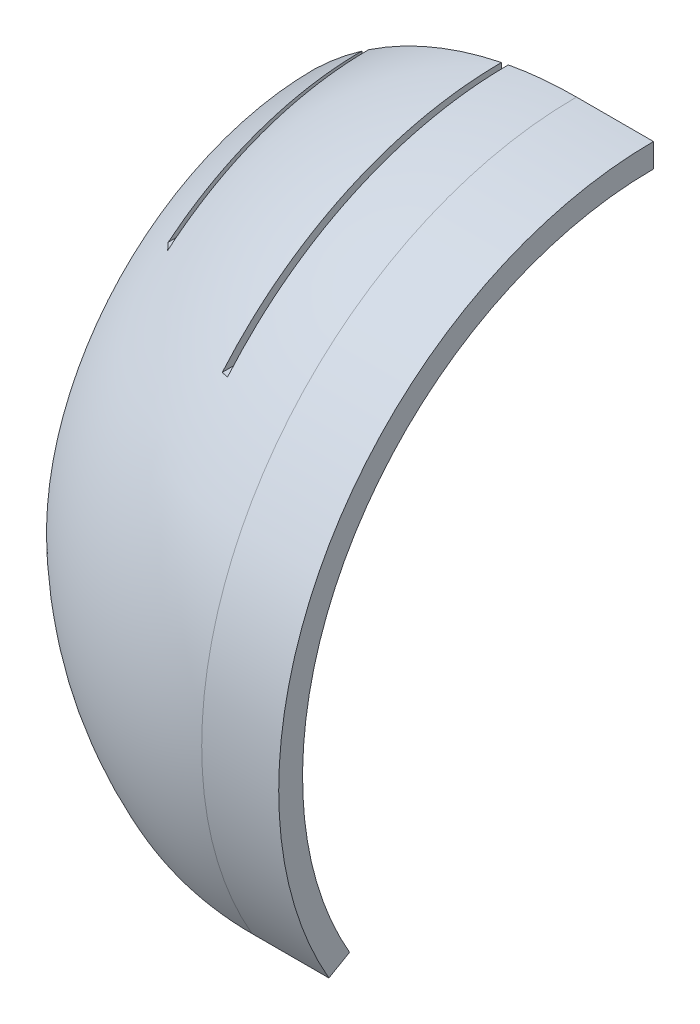
ISO-10303-21;
HEADER;
FILE_DESCRIPTION(('STEP AP214'),'2;1');
FILE_NAME('part.step','',(''),(''),'','','');
FILE_SCHEMA(('AUTOMOTIVE_DESIGN { 1 0 10303 214 1 1 1 1 }'));
ENDSEC;
DATA;
#1=APPLICATION_CONTEXT('core data for automotive mechanical design processes');
#2=APPLICATION_PROTOCOL_DEFINITION('international standard','automotive_design',2000,#1);
#3=PRODUCT_CONTEXT('',#1,'mechanical');
#4=PRODUCT('Part','Part','',(#3));
#5=PRODUCT_RELATED_PRODUCT_CATEGORY('part','',(#4));
#6=PRODUCT_DEFINITION_FORMATION('','',#4);
#7=PRODUCT_DEFINITION_CONTEXT('part definition',#1,'design');
#8=PRODUCT_DEFINITION('design','',#6,#7);
#9=PRODUCT_DEFINITION_SHAPE('','',#8);
#10=(LENGTH_UNIT() NAMED_UNIT(*) SI_UNIT(.MILLI.,.METRE.));
#11=(NAMED_UNIT(*) PLANE_ANGLE_UNIT() SI_UNIT($,.RADIAN.));
#12=(NAMED_UNIT(*) SI_UNIT($,.STERADIAN.) SOLID_ANGLE_UNIT());
#13=UNCERTAINTY_MEASURE_WITH_UNIT(LENGTH_MEASURE(1.E-05),#10,'distance_accuracy_value','');
#14=(GEOMETRIC_REPRESENTATION_CONTEXT(3) GLOBAL_UNCERTAINTY_ASSIGNED_CONTEXT((#13)) GLOBAL_UNIT_ASSIGNED_CONTEXT((#10,
#11,#12)) REPRESENTATION_CONTEXT('',''));
#15=CARTESIAN_POINT('',(0.,0.,0.));
#16=DIRECTION('',(0.,0.,1.));
#17=DIRECTION('',(1.,0.,0.));
#18=AXIS2_PLACEMENT_3D('',#15,#16,#17);
#19=CARTESIAN_POINT('',(0.,0.,0.));
#20=DIRECTION('',(0.,0.,1.));
#21=DIRECTION('',(1.,0.,0.));
#22=AXIS2_PLACEMENT_3D('',#19,#20,#21);
#23=PLANE('',#22);
#24=CARTESIAN_POINT('',(0.,0.,0.));
#25=DIRECTION('',(0.,0.,1.));
#26=DIRECTION('',(1.,0.,0.));
#27=AXIS2_PLACEMENT_3D('',#24,#25,#26);
#28=CIRCLE('',#27,55.);
#29=CARTESIAN_POINT('',(-31.5,45.0860288781347,0.));
#30=VERTEX_POINT('',#29);
#31=CARTESIAN_POINT('',(-38.5,39.2778563569857,0.));
#32=VERTEX_POINT('',#31);
#33=EDGE_CURVE('E216',#30,#32,#28,.T.);
#34=ORIENTED_EDGE('',*,*,#33,.F.);
#35=DIRECTION('',(0.,-1.,0.));
#36=VECTOR('',#35,1.);
#37=CARTESIAN_POINT('',(-31.5,0.,0.));
#38=LINE('',#37,#36);
#39=CARTESIAN_POINT('',(-31.5,40.7430975749267,0.));
#40=VERTEX_POINT('',#39);
#41=EDGE_CURVE('E253',#30,#40,#38,.T.);
#42=ORIENTED_EDGE('',*,*,#41,.T.);
#43=CARTESIAN_POINT('',(0.,0.,0.));
#44=DIRECTION('',(0.,0.,1.));
#45=DIRECTION('',(1.,0.,0.));
#46=AXIS2_PLACEMENT_3D('',#43,#44,#45);
#47=CIRCLE('',#46,51.5);
#48=CARTESIAN_POINT('',(-38.5,34.2052627529741,0.));
#49=VERTEX_POINT('',#48);
#50=EDGE_CURVE('E222',#49,#40,#47,.F.);
#51=ORIENTED_EDGE('',*,*,#50,.F.);
#52=DIRECTION('',(0.,1.,0.));
#53=VECTOR('',#52,1.);
#54=CARTESIAN_POINT('',(-38.5,0.,0.));
#55=LINE('',#54,#53);
#56=EDGE_CURVE('E237',#49,#32,#55,.T.);
#57=ORIENTED_EDGE('',*,*,#56,.T.);
#58=EDGE_LOOP('',(#34,#42,#51,#57));
#59=FACE_BOUND('',#58,.T.);
#60=ADVANCED_FACE('F50',(#59),#23,.F.);
#61=CARTESIAN_POINT('',(-10.,50.519798099359,0.));
#62=VERTEX_POINT('',#61);
#63=CARTESIAN_POINT('',(0.,51.5,0.));
#64=VERTEX_POINT('',#63);
#65=EDGE_CURVE('E220',#62,#64,#47,.F.);
#66=ORIENTED_EDGE('',*,*,#65,.F.);
#67=DIRECTION('',(0.,1.,0.));
#68=VECTOR('',#67,1.);
#69=CARTESIAN_POINT('',(-10.,0.,0.));
#70=LINE('',#69,#68);
#71=CARTESIAN_POINT('',(-10.,54.0832691319598,0.));
#72=VERTEX_POINT('',#71);
#73=EDGE_CURVE('E248',#62,#72,#70,.T.);
#74=ORIENTED_EDGE('',*,*,#73,.T.);
#75=CARTESIAN_POINT('',(0.,55.,0.));
#76=VERTEX_POINT('',#75);
#77=EDGE_CURVE('E217',#76,#72,#28,.T.);
#78=ORIENTED_EDGE('',*,*,#77,.F.);
#79=DIRECTION('',(-1.,0.,0.));
#80=VECTOR('',#79,1.);
#81=CARTESIAN_POINT('',(10.,55.,0.));
#82=LINE('',#81,#80);
#83=CARTESIAN_POINT('',(11.3,55.,-1.92031473636372E-13));
#84=VERTEX_POINT('',#83);
#85=EDGE_CURVE('E161',#84,#76,#82,.T.);
#86=ORIENTED_EDGE('',*,*,#85,.F.);
#87=DIRECTION('',(0.,1.,0.));
#88=VECTOR('',#87,1.);
#89=CARTESIAN_POINT('',(11.3,55.,-1.92031473636372E-13));
#90=LINE('',#89,#88);
#91=CARTESIAN_POINT('',(11.3,51.5,-1.79811288950421E-13));
#92=VERTEX_POINT('',#91);
#93=EDGE_CURVE('E162',#92,#84,#90,.T.);
#94=ORIENTED_EDGE('',*,*,#93,.F.);
#95=DIRECTION('',(-1.,0.,0.));
#96=VECTOR('',#95,1.);
#97=CARTESIAN_POINT('',(0.,51.5,0.));
#98=LINE('',#97,#96);
#99=EDGE_CURVE('E13',#64,#92,#98,.F.);
#100=ORIENTED_EDGE('',*,*,#99,.F.);
#101=EDGE_LOOP('',(#66,#74,#78,#86,#94,#100));
#102=FACE_BOUND('',#101,.T.);
#103=ADVANCED_FACE('F286',(#102),#23,.F.);
#104=CARTESIAN_POINT('',(0.,0.,0.));
#105=DIRECTION('',(0.,-1.,0.));
#106=DIRECTION('',(-1.,0.,0.));
#107=AXIS2_PLACEMENT_3D('',#104,#105,#106);
#108=SPHERICAL_SURFACE('',#107,51.5);
#109=ORIENTED_EDGE('',*,*,#50,.T.);
#110=CARTESIAN_POINT('',(-31.5,0.,0.));
#111=DIRECTION('',(-1.,0.,0.));
#112=DIRECTION('',(0.,0.,1.));
#113=AXIS2_PLACEMENT_3D('',#110,#111,#112);
#114=CIRCLE('',#113,40.7430975749267);
#115=CARTESIAN_POINT('',(-31.5,35.,20.8566536146142));
#116=VERTEX_POINT('',#115);
#117=EDGE_CURVE('E207',#40,#116,#114,.F.);
#118=ORIENTED_EDGE('',*,*,#117,.T.);
#119=CARTESIAN_POINT('',(0.,35.,0.));
#120=DIRECTION('',(0.,-1.,0.));
#121=DIRECTION('',(0.,0.,-1.));
#122=AXIS2_PLACEMENT_3D('',#119,#120,#121);
#123=CIRCLE('',#122,37.7789623997272);
#124=CARTESIAN_POINT('',(-30.5,35.,22.2934968096079));
#125=VERTEX_POINT('',#124);
#126=EDGE_CURVE('E213',#116,#125,#123,.F.);
#127=ORIENTED_EDGE('',*,*,#126,.T.);
#128=CARTESIAN_POINT('',(-30.5,0.,0.));
#129=DIRECTION('',(1.,0.,0.));
#130=DIRECTION('',(0.,1.,0.));
#131=AXIS2_PLACEMENT_3D('',#128,#129,#130);
#132=CIRCLE('',#131,41.4969878424928);
#133=CARTESIAN_POINT('',(-30.5,41.4969878424928,0.));
#134=VERTEX_POINT('',#133);
#135=EDGE_CURVE('E201',#125,#134,#132,.F.);
#136=ORIENTED_EDGE('',*,*,#135,.T.);
#137=CARTESIAN_POINT('',(-11.,50.3115294937453,0.));
#138=VERTEX_POINT('',#137);
#139=EDGE_CURVE('E226',#134,#138,#47,.F.);
#140=ORIENTED_EDGE('',*,*,#139,.T.);
#141=CARTESIAN_POINT('',(-11.,0.,0.));
#142=DIRECTION('',(-1.,0.,0.));
#143=DIRECTION('',(0.,-1.,0.));
#144=AXIS2_PLACEMENT_3D('',#141,#142,#143);
#145=CIRCLE('',#144,50.3115294937453);
#146=CARTESIAN_POINT('',(-11.,35.,36.1420807370024));
#147=VERTEX_POINT('',#146);
#148=EDGE_CURVE('E65',#138,#147,#145,.F.);
#149=ORIENTED_EDGE('',*,*,#148,.T.);
#150=CARTESIAN_POINT('',(0.,35.,0.));
#151=DIRECTION('',(0.,-1.,0.));
#152=DIRECTION('',(0.,0.,-1.));
#153=AXIS2_PLACEMENT_3D('',#150,#151,#152);
#154=CIRCLE('',#153,37.7789623997272);
#155=CARTESIAN_POINT('',(-10.,35.,36.4314424638937));
#156=VERTEX_POINT('',#155);
#157=EDGE_CURVE('E210',#147,#156,#154,.F.);
#158=ORIENTED_EDGE('',*,*,#157,.T.);
#159=CARTESIAN_POINT('',(-10.,0.,0.));
#160=DIRECTION('',(1.,0.,0.));
#161=DIRECTION('',(0.,0.,-1.));
#162=AXIS2_PLACEMENT_3D('',#159,#160,#161);
#163=CIRCLE('',#162,50.519798099359);
#164=EDGE_CURVE('E197',#156,#62,#163,.F.);
#165=ORIENTED_EDGE('',*,*,#164,.T.);
#166=ORIENTED_EDGE('',*,*,#65,.T.);
#167=CARTESIAN_POINT('',(0.,0.,0.));
#168=DIRECTION('',(-1.,0.,0.));
#169=DIRECTION('',(0.,0.,1.));
#170=AXIS2_PLACEMENT_3D('',#167,#168,#169);
#171=CIRCLE('',#170,51.5);
#172=CARTESIAN_POINT('',(0.,-25.7500000000002,44.6003082948985));
#173=VERTEX_POINT('',#172);
#174=EDGE_CURVE('E235',#64,#173,#171,.F.);
#175=ORIENTED_EDGE('',*,*,#174,.T.);
#176=CARTESIAN_POINT('',(0.,0.,0.));
#177=DIRECTION('',(0.,0.866025403784436,0.500000000000004));
#178=DIRECTION('',(0.,-0.500000000000004,0.866025403784436));
#179=AXIS2_PLACEMENT_3D('',#176,#177,#178);
#180=CIRCLE('',#179,51.5);
#181=CARTESIAN_POINT('',(-38.5,-17.1026313764872,29.6226264871972));
#182=VERTEX_POINT('',#181);
#183=EDGE_CURVE('E228',#173,#182,#180,.F.);
#184=ORIENTED_EDGE('',*,*,#183,.T.);
#185=CARTESIAN_POINT('',(-38.5,0.,0.));
#186=DIRECTION('',(-1.,0.,0.));
#187=DIRECTION('',(0.,0.,1.));
#188=AXIS2_PLACEMENT_3D('',#185,#186,#187);
#189=CIRCLE('',#188,34.2052627529741);
#190=EDGE_CURVE('E232',#49,#182,#189,.F.);
#191=ORIENTED_EDGE('',*,*,#190,.F.);
#192=EDGE_LOOP('',(#109,#118,#127,#136,#140,#149,#158,#165,#166,#175,#184,#191));
#193=FACE_BOUND('',#192,.T.);
#194=ADVANCED_FACE('F268',(#193),#108,.F.);
#195=CARTESIAN_POINT('',(0.,0.,0.));
#196=DIRECTION('',(0.,-1.,0.));
#197=DIRECTION('',(-1.,0.,0.));
#198=AXIS2_PLACEMENT_3D('',#195,#196,#197);
#199=SPHERICAL_SURFACE('',#198,55.);
#200=CARTESIAN_POINT('',(0.,35.,0.));
#201=DIRECTION('',(0.,-1.,0.));
#202=DIRECTION('',(0.,0.,-1.));
#203=AXIS2_PLACEMENT_3D('',#200,#201,#202);
#204=CIRCLE('',#203,42.4264068711928);
#205=CARTESIAN_POINT('',(-30.5,35.,29.4915242061173));
#206=VERTEX_POINT('',#205);
#207=CARTESIAN_POINT('',(-31.5,35.,28.4209429822446));
#208=VERTEX_POINT('',#207);
#209=EDGE_CURVE('E259',#206,#208,#204,.T.);
#210=ORIENTED_EDGE('',*,*,#209,.T.);
#211=CARTESIAN_POINT('',(-31.5,0.,0.));
#212=DIRECTION('',(-1.,0.,0.));
#213=DIRECTION('',(0.,0.,1.));
#214=AXIS2_PLACEMENT_3D('',#211,#212,#213);
#215=CIRCLE('',#214,45.0860288781347);
#216=EDGE_CURVE('E204',#208,#30,#215,.T.);
#217=ORIENTED_EDGE('',*,*,#216,.T.);
#218=ORIENTED_EDGE('',*,*,#33,.T.);
#219=CARTESIAN_POINT('',(-38.5,0.,0.));
#220=DIRECTION('',(-1.,0.,0.));
#221=DIRECTION('',(0.,0.,1.));
#222=AXIS2_PLACEMENT_3D('',#219,#220,#221);
#223=CIRCLE('',#222,39.2778563569857);
#224=CARTESIAN_POINT('',(-38.5,-19.638928178493,34.0156214113456));
#225=VERTEX_POINT('',#224);
#226=EDGE_CURVE('E231',#225,#32,#223,.T.);
#227=ORIENTED_EDGE('',*,*,#226,.F.);
#228=CARTESIAN_POINT('',(0.,0.,0.));
#229=DIRECTION('',(0.,0.866025403784436,0.500000000000004));
#230=DIRECTION('',(0.,-0.500000000000004,0.866025403784436));
#231=AXIS2_PLACEMENT_3D('',#228,#229,#230);
#232=CIRCLE('',#231,55.);
#233=CARTESIAN_POINT('',(0.,-27.5000000000002,47.631397208144));
#234=VERTEX_POINT('',#233);
#235=EDGE_CURVE('E225',#225,#234,#232,.T.);
#236=ORIENTED_EDGE('',*,*,#235,.T.);
#237=CARTESIAN_POINT('',(0.,0.,0.));
#238=DIRECTION('',(-1.,0.,0.));
#239=DIRECTION('',(0.,0.,1.));
#240=AXIS2_PLACEMENT_3D('',#237,#238,#239);
#241=CIRCLE('',#240,55.);
#242=EDGE_CURVE('E158',#234,#76,#241,.T.);
#243=ORIENTED_EDGE('',*,*,#242,.T.);
#244=ORIENTED_EDGE('',*,*,#77,.T.);
#245=CARTESIAN_POINT('',(-10.,0.,0.));
#246=DIRECTION('',(1.,0.,0.));
#247=DIRECTION('',(0.,0.,-1.));
#248=AXIS2_PLACEMENT_3D('',#245,#246,#247);
#249=CIRCLE('',#248,54.0832691319598);
#250=CARTESIAN_POINT('',(-10.,35.,41.2310562561766));
#251=VERTEX_POINT('',#250);
#252=EDGE_CURVE('E194',#72,#251,#249,.T.);
#253=ORIENTED_EDGE('',*,*,#252,.T.);
#254=CARTESIAN_POINT('',(0.,35.,0.));
#255=DIRECTION('',(0.,-1.,0.));
#256=DIRECTION('',(0.,0.,-1.));
#257=AXIS2_PLACEMENT_3D('',#254,#255,#256);
#258=CIRCLE('',#257,42.4264068711928);
#259=CARTESIAN_POINT('',(-11.,35.,40.9756024970958));
#260=VERTEX_POINT('',#259);
#261=EDGE_CURVE('E256',#251,#260,#258,.T.);
#262=ORIENTED_EDGE('',*,*,#261,.T.);
#263=CARTESIAN_POINT('',(-11.,0.,0.));
#264=DIRECTION('',(-1.,0.,0.));
#265=DIRECTION('',(0.,-1.,0.));
#266=AXIS2_PLACEMENT_3D('',#263,#264,#265);
#267=CIRCLE('',#266,53.8887743412299);
#268=CARTESIAN_POINT('',(-11.,53.8887743412299,0.));
#269=VERTEX_POINT('',#268);
#270=EDGE_CURVE('E185',#260,#269,#267,.T.);
#271=ORIENTED_EDGE('',*,*,#270,.T.);
#272=CARTESIAN_POINT('',(-30.5,45.7684389071771,0.));
#273=VERTEX_POINT('',#272);
#274=EDGE_CURVE('E221',#269,#273,#28,.T.);
#275=ORIENTED_EDGE('',*,*,#274,.T.);
#276=CARTESIAN_POINT('',(-30.5,0.,0.));
#277=DIRECTION('',(1.,0.,0.));
#278=DIRECTION('',(0.,1.,0.));
#279=AXIS2_PLACEMENT_3D('',#276,#277,#278);
#280=CIRCLE('',#279,45.7684389071771);
#281=EDGE_CURVE('E73',#273,#206,#280,.T.);
#282=ORIENTED_EDGE('',*,*,#281,.T.);
#283=EDGE_LOOP('',(#210,#217,#218,#227,#236,#243,#244,#253,#262,#271,#275,#282));
#284=FACE_BOUND('',#283,.T.);
#285=ADVANCED_FACE('F52',(#284),#199,.T.);
#286=CARTESIAN_POINT('',(-38.5,0.,-55.));
#287=DIRECTION('',(-1.,0.,0.));
#288=DIRECTION('',(0.,0.,1.));
#289=AXIS2_PLACEMENT_3D('',#286,#287,#288);
#290=PLANE('',#289);
#291=DIRECTION('',(0.,0.500000000000004,-0.866025403784436));
#292=VECTOR('',#291,1.);
#293=CARTESIAN_POINT('',(-38.5,23.8156986040722,-41.2499999999998));
#294=LINE('',#293,#292);
#295=EDGE_CURVE('E244',#225,#182,#294,.T.);
#296=ORIENTED_EDGE('',*,*,#295,.F.);
#297=ORIENTED_EDGE('',*,*,#226,.T.);
#298=ORIENTED_EDGE('',*,*,#56,.F.);
#299=ORIENTED_EDGE('',*,*,#190,.T.);
#300=EDGE_LOOP('',(#296,#297,#298,#299));
#301=FACE_BOUND('',#300,.T.);
#302=ADVANCED_FACE('F289',(#301),#290,.T.);
#303=ORIENTED_EDGE('',*,*,#139,.F.);
#304=DIRECTION('',(0.,1.,0.));
#305=VECTOR('',#304,1.);
#306=CARTESIAN_POINT('',(-30.5,0.,0.));
#307=LINE('',#306,#305);
#308=EDGE_CURVE('E251',#134,#273,#307,.T.);
#309=ORIENTED_EDGE('',*,*,#308,.T.);
#310=ORIENTED_EDGE('',*,*,#274,.F.);
#311=DIRECTION('',(0.,-1.,0.));
#312=VECTOR('',#311,1.);
#313=CARTESIAN_POINT('',(-11.,0.,0.));
#314=LINE('',#313,#312);
#315=EDGE_CURVE('E246',#269,#138,#314,.T.);
#316=ORIENTED_EDGE('',*,*,#315,.T.);
#317=EDGE_LOOP('',(#303,#309,#310,#316));
#318=FACE_BOUND('',#317,.T.);
#319=ADVANCED_FACE('F274',(#318),#23,.F.);
#320=CARTESIAN_POINT('',(0.,0.,0.));
#321=DIRECTION('',(0.,0.866025403784436,0.500000000000004));
#322=DIRECTION('',(0.,-0.500000000000004,0.866025403784436));
#323=AXIS2_PLACEMENT_3D('',#320,#321,#322);
#324=PLANE('',#323);
#325=ORIENTED_EDGE('',*,*,#183,.F.);
#326=DIRECTION('',(-1.,0.,0.));
#327=VECTOR('',#326,1.);
#328=CARTESIAN_POINT('',(0.,-25.7500000000002,44.6003082948985));
#329=LINE('',#328,#327);
#330=CARTESIAN_POINT('',(11.3,-25.7500000000002,44.6003082948985));
#331=VERTEX_POINT('',#330);
#332=EDGE_CURVE('E58',#331,#173,#329,.T.);
#333=ORIENTED_EDGE('',*,*,#332,.F.);
#334=DIRECTION('',(0.,0.500000000000004,-0.866025403784436));
#335=VECTOR('',#334,1.);
#336=CARTESIAN_POINT('',(11.3,13.7500000000002,-23.8156986040722));
#337=LINE('',#336,#335);
#338=CARTESIAN_POINT('',(11.3,-27.5000000000002,47.631397208144));
#339=VERTEX_POINT('',#338);
#340=EDGE_CURVE('E165',#339,#331,#337,.T.);
#341=ORIENTED_EDGE('',*,*,#340,.F.);
#342=DIRECTION('',(-1.,0.,0.));
#343=VECTOR('',#342,1.);
#344=CARTESIAN_POINT('',(10.,-27.5000000000002,47.631397208144));
#345=LINE('',#344,#343);
#346=EDGE_CURVE('E152',#339,#234,#345,.T.);
#347=ORIENTED_EDGE('',*,*,#346,.T.);
#348=ORIENTED_EDGE('',*,*,#235,.F.);
#349=ORIENTED_EDGE('',*,*,#295,.T.);
#350=EDGE_LOOP('',(#325,#333,#341,#347,#348,#349));
#351=FACE_BOUND('',#350,.T.);
#352=ADVANCED_FACE('F167',(#351),#324,.F.);
#353=CARTESIAN_POINT('',(-11.,35.,55.));
#354=DIRECTION('',(0.,-1.,0.));
#355=DIRECTION('',(0.,0.,-1.));
#356=AXIS2_PLACEMENT_3D('',#353,#354,#355);
#357=PLANE('',#356);
#358=DIRECTION('',(0.,0.,-1.));
#359=VECTOR('',#358,1.);
#360=CARTESIAN_POINT('',(-11.,35.,55.));
#361=LINE('',#360,#359);
#362=EDGE_CURVE('E175',#260,#147,#361,.T.);
#363=ORIENTED_EDGE('',*,*,#362,.F.);
#364=ORIENTED_EDGE('',*,*,#261,.F.);
#365=DIRECTION('',(0.,0.,-1.));
#366=VECTOR('',#365,1.);
#367=CARTESIAN_POINT('',(-10.,35.,55.));
#368=LINE('',#367,#366);
#369=EDGE_CURVE('E178',#251,#156,#368,.T.);
#370=ORIENTED_EDGE('',*,*,#369,.T.);
#371=ORIENTED_EDGE('',*,*,#157,.F.);
#372=EDGE_LOOP('',(#363,#364,#370,#371));
#373=FACE_BOUND('',#372,.T.);
#374=ADVANCED_FACE('F282',(#373),#357,.F.);
#375=CARTESIAN_POINT('',(-10.,35.,55.));
#376=DIRECTION('',(1.,0.,0.));
#377=DIRECTION('',(0.,0.,-1.));
#378=AXIS2_PLACEMENT_3D('',#375,#376,#377);
#379=PLANE('',#378);
#380=ORIENTED_EDGE('',*,*,#369,.F.);
#381=ORIENTED_EDGE('',*,*,#252,.F.);
#382=ORIENTED_EDGE('',*,*,#73,.F.);
#383=ORIENTED_EDGE('',*,*,#164,.F.);
#384=EDGE_LOOP('',(#380,#381,#382,#383));
#385=FACE_BOUND('',#384,.T.);
#386=ADVANCED_FACE('F284',(#385),#379,.F.);
#387=CARTESIAN_POINT('',(-11.,55.,55.));
#388=DIRECTION('',(-1.,0.,0.));
#389=DIRECTION('',(0.,-1.,0.));
#390=AXIS2_PLACEMENT_3D('',#387,#388,#389);
#391=PLANE('',#390);
#392=ORIENTED_EDGE('',*,*,#315,.F.);
#393=ORIENTED_EDGE('',*,*,#270,.F.);
#394=ORIENTED_EDGE('',*,*,#362,.T.);
#395=ORIENTED_EDGE('',*,*,#148,.F.);
#396=EDGE_LOOP('',(#392,#393,#394,#395));
#397=FACE_BOUND('',#396,.T.);
#398=ADVANCED_FACE('F277',(#397),#391,.F.);
#399=CARTESIAN_POINT('',(-31.5,35.,55.));
#400=DIRECTION('',(0.,-1.,0.));
#401=DIRECTION('',(0.,0.,-1.));
#402=AXIS2_PLACEMENT_3D('',#399,#400,#401);
#403=PLANE('',#402);
#404=DIRECTION('',(0.,0.,-1.));
#405=VECTOR('',#404,1.);
#406=CARTESIAN_POINT('',(-31.5,35.,55.));
#407=LINE('',#406,#405);
#408=EDGE_CURVE('E182',#208,#116,#407,.T.);
#409=ORIENTED_EDGE('',*,*,#408,.F.);
#410=ORIENTED_EDGE('',*,*,#209,.F.);
#411=DIRECTION('',(0.,0.,-1.));
#412=VECTOR('',#411,1.);
#413=CARTESIAN_POINT('',(-30.5,35.,55.));
#414=LINE('',#413,#412);
#415=EDGE_CURVE('E186',#206,#125,#414,.T.);
#416=ORIENTED_EDGE('',*,*,#415,.T.);
#417=ORIENTED_EDGE('',*,*,#126,.F.);
#418=EDGE_LOOP('',(#409,#410,#416,#417));
#419=FACE_BOUND('',#418,.T.);
#420=ADVANCED_FACE('F297',(#419),#403,.F.);
#421=CARTESIAN_POINT('',(-31.5,55.,55.));
#422=DIRECTION('',(-1.,0.,0.));
#423=DIRECTION('',(0.,0.,1.));
#424=AXIS2_PLACEMENT_3D('',#421,#422,#423);
#425=PLANE('',#424);
#426=ORIENTED_EDGE('',*,*,#41,.F.);
#427=ORIENTED_EDGE('',*,*,#216,.F.);
#428=ORIENTED_EDGE('',*,*,#408,.T.);
#429=ORIENTED_EDGE('',*,*,#117,.F.);
#430=EDGE_LOOP('',(#426,#427,#428,#429));
#431=FACE_BOUND('',#430,.T.);
#432=ADVANCED_FACE('F294',(#431),#425,.F.);
#433=CARTESIAN_POINT('',(-30.5,55.,55.));
#434=DIRECTION('',(1.,0.,0.));
#435=DIRECTION('',(0.,1.,0.));
#436=AXIS2_PLACEMENT_3D('',#433,#434,#435);
#437=PLANE('',#436);
#438=ORIENTED_EDGE('',*,*,#415,.F.);
#439=ORIENTED_EDGE('',*,*,#281,.F.);
#440=ORIENTED_EDGE('',*,*,#308,.F.);
#441=ORIENTED_EDGE('',*,*,#135,.F.);
#442=EDGE_LOOP('',(#438,#439,#440,#441));
#443=FACE_BOUND('',#442,.T.);
#444=ADVANCED_FACE('F298',(#443),#437,.F.);
#445=CARTESIAN_POINT('',(0.,0.,0.));
#446=DIRECTION('',(-1.,0.,0.));
#447=DIRECTION('',(0.,0.,1.));
#448=AXIS2_PLACEMENT_3D('',#445,#446,#447);
#449=CYLINDRICAL_SURFACE('',#448,55.);
#450=CARTESIAN_POINT('',(11.3,0.,0.));
#451=DIRECTION('',(-1.,0.,0.));
#452=DIRECTION('',(0.,0.,1.));
#453=AXIS2_PLACEMENT_3D('',#450,#451,#452);
#454=CIRCLE('',#453,55.);
#455=EDGE_CURVE('E156',#339,#84,#454,.T.);
#456=ORIENTED_EDGE('',*,*,#455,.T.);
#457=ORIENTED_EDGE('',*,*,#85,.T.);
#458=ORIENTED_EDGE('',*,*,#242,.F.);
#459=ORIENTED_EDGE('',*,*,#346,.F.);
#460=EDGE_LOOP('',(#456,#457,#458,#459));
#461=FACE_BOUND('',#460,.T.);
#462=ADVANCED_FACE('F154',(#461),#449,.T.);
#463=CARTESIAN_POINT('',(11.3,55.,0.));
#464=DIRECTION('',(-1.,0.,0.));
#465=DIRECTION('',(0.,0.,1.));
#466=AXIS2_PLACEMENT_3D('',#463,#464,#465);
#467=PLANE('',#466);
#468=CARTESIAN_POINT('',(11.3,0.,0.));
#469=DIRECTION('',(-1.,0.,0.));
#470=DIRECTION('',(0.,0.,1.));
#471=AXIS2_PLACEMENT_3D('',#468,#469,#470);
#472=CIRCLE('',#471,51.5);
#473=EDGE_CURVE('E176',#331,#92,#472,.T.);
#474=ORIENTED_EDGE('',*,*,#473,.T.);
#475=ORIENTED_EDGE('',*,*,#93,.T.);
#476=ORIENTED_EDGE('',*,*,#455,.F.);
#477=ORIENTED_EDGE('',*,*,#340,.T.);
#478=EDGE_LOOP('',(#474,#475,#476,#477));
#479=FACE_BOUND('',#478,.T.);
#480=ADVANCED_FACE('F173',(#479),#467,.F.);
#481=CARTESIAN_POINT('',(0.,0.,0.));
#482=DIRECTION('',(-1.,0.,0.));
#483=DIRECTION('',(0.,0.,1.));
#484=AXIS2_PLACEMENT_3D('',#481,#482,#483);
#485=CYLINDRICAL_SURFACE('',#484,51.5);
#486=ORIENTED_EDGE('',*,*,#99,.T.);
#487=ORIENTED_EDGE('',*,*,#473,.F.);
#488=ORIENTED_EDGE('',*,*,#332,.T.);
#489=ORIENTED_EDGE('',*,*,#174,.F.);
#490=EDGE_LOOP('',(#486,#487,#488,#489));
#491=FACE_BOUND('',#490,.T.);
#492=ADVANCED_FACE('F263',(#491),#485,.F.);
#493=CLOSED_SHELL('',(#60,#103,#194,#285,#302,#319,#352,#374,#386,#398,#420,#432,#444,#462,#480,#492));
#494=MANIFOLD_SOLID_BREP('B2',#493);
#495=ADVANCED_BREP_SHAPE_REPRESENTATION('',(#18,#494),#14);
#496=SHAPE_DEFINITION_REPRESENTATION(#9,#495);
ENDSEC;
END-ISO-10303-21;
